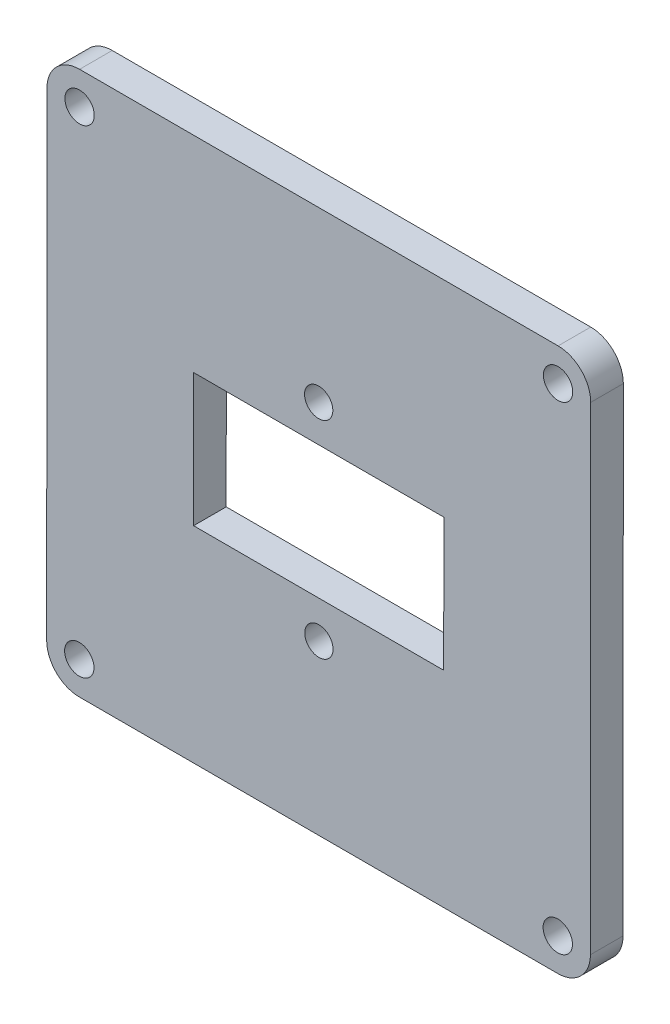
ISO-10303-21;
HEADER;
FILE_DESCRIPTION(('STEP AP214'),'2;1');
FILE_NAME('part.step','',(''),(''),'','','');
FILE_SCHEMA(('AUTOMOTIVE_DESIGN { 1 0 10303 214 1 1 1 1 }'));
ENDSEC;
DATA;
#1=APPLICATION_CONTEXT('core data for automotive mechanical design processes');
#2=APPLICATION_PROTOCOL_DEFINITION('international standard','automotive_design',2000,#1);
#3=PRODUCT_CONTEXT('',#1,'mechanical');
#4=PRODUCT('Part','Part','',(#3));
#5=PRODUCT_RELATED_PRODUCT_CATEGORY('part','',(#4));
#6=PRODUCT_DEFINITION_FORMATION('','',#4);
#7=PRODUCT_DEFINITION_CONTEXT('part definition',#1,'design');
#8=PRODUCT_DEFINITION('design','',#6,#7);
#9=PRODUCT_DEFINITION_SHAPE('','',#8);
#10=(LENGTH_UNIT() NAMED_UNIT(*) SI_UNIT(.MILLI.,.METRE.));
#11=(NAMED_UNIT(*) PLANE_ANGLE_UNIT() SI_UNIT($,.RADIAN.));
#12=(NAMED_UNIT(*) SI_UNIT($,.STERADIAN.) SOLID_ANGLE_UNIT());
#13=UNCERTAINTY_MEASURE_WITH_UNIT(LENGTH_MEASURE(1.E-05),#10,'distance_accuracy_value','');
#14=(GEOMETRIC_REPRESENTATION_CONTEXT(3) GLOBAL_UNCERTAINTY_ASSIGNED_CONTEXT((#13)) GLOBAL_UNIT_ASSIGNED_CONTEXT((#10,
#11,#12)) REPRESENTATION_CONTEXT('',''));
#15=CARTESIAN_POINT('',(0.,0.,0.));
#16=DIRECTION('',(0.,0.,1.));
#17=DIRECTION('',(1.,0.,0.));
#18=AXIS2_PLACEMENT_3D('',#15,#16,#17);
#19=CARTESIAN_POINT('',(294.111009057403,60.8485575874657,-1.28360863604904E-11));
#20=DIRECTION('',(0.,0.,1.));
#21=DIRECTION('',(1.,0.,0.));
#22=AXIS2_PLACEMENT_3D('',#19,#20,#21);
#23=CYLINDRICAL_SURFACE('',#22,3.00000000000005);
#24=CARTESIAN_POINT('',(294.111009057403,60.8485575874657,2.99999999999992));
#25=DIRECTION('',(0.,0.,1.));
#26=DIRECTION('',(1.,0.,0.));
#27=AXIS2_PLACEMENT_3D('',#24,#25,#26);
#28=CIRCLE('',#27,3.00000000000005);
#29=CARTESIAN_POINT('',(294.112797724359,63.8485570542442,2.99999999999992));
#30=VERTEX_POINT('',#29);
#31=CARTESIAN_POINT('',(291.111009590624,60.8503462544219,2.99999999999992));
#32=VERTEX_POINT('',#31);
#33=EDGE_CURVE('E196',#30,#32,#28,.T.);
#34=ORIENTED_EDGE('',*,*,#33,.F.);
#35=DIRECTION('',(0.,0.,1.));
#36=VECTOR('',#35,1.);
#37=CARTESIAN_POINT('',(294.112797724359,63.8485570542442,-1.28360863604904E-11));
#38=LINE('',#37,#36);
#39=CARTESIAN_POINT('',(294.112797724359,63.8485570542442,-1.28360863604904E-11));
#40=VERTEX_POINT('',#39);
#41=EDGE_CURVE('E11',#40,#30,#38,.T.);
#42=ORIENTED_EDGE('',*,*,#41,.F.);
#43=CARTESIAN_POINT('',(294.111009057403,60.8485575874657,-1.28360863604904E-11));
#44=DIRECTION('',(0.,0.,1.));
#45=DIRECTION('',(1.,0.,0.));
#46=AXIS2_PLACEMENT_3D('',#43,#44,#45);
#47=CIRCLE('',#46,3.00000000000005);
#48=CARTESIAN_POINT('',(291.111009590624,60.8503462544219,-1.28360863604904E-11));
#49=VERTEX_POINT('',#48);
#50=EDGE_CURVE('E199',#40,#49,#47,.T.);
#51=ORIENTED_EDGE('',*,*,#50,.T.);
#52=DIRECTION('',(0.,0.,1.));
#53=VECTOR('',#52,1.);
#54=CARTESIAN_POINT('',(291.111009590624,60.8503462544219,-1.28360863604904E-11));
#55=LINE('',#54,#53);
#56=EDGE_CURVE('E40',#49,#32,#55,.T.);
#57=ORIENTED_EDGE('',*,*,#56,.T.);
#58=EDGE_LOOP('',(#34,#42,#51,#57));
#59=FACE_BOUND('',#58,.T.);
#60=ADVANCED_FACE('F37',(#59),#23,.T.);
#61=CARTESIAN_POINT('',(338.112738889808,63.8223233026353,-1.28360863604904E-11));
#62=DIRECTION('',(0.00059622231873901,0.999999822259457,0.));
#63=DIRECTION('',(-0.999999822259457,0.00059622231873901,0.));
#64=AXIS2_PLACEMENT_3D('',#61,#62,#63);
#65=PLANE('',#64);
#66=DIRECTION('',(-0.999999822259458,0.00059622231873901,0.));
#67=VECTOR('',#66,1.);
#68=CARTESIAN_POINT('',(338.112738889808,63.8223233026353,2.99999999999992));
#69=LINE('',#68,#67);
#70=CARTESIAN_POINT('',(338.112738889808,63.8223233026353,2.99999999999992));
#71=VERTEX_POINT('',#70);
#72=EDGE_CURVE('E203',#71,#30,#69,.T.);
#73=ORIENTED_EDGE('',*,*,#72,.F.);
#74=DIRECTION('',(0.,0.,1.));
#75=VECTOR('',#74,1.);
#76=CARTESIAN_POINT('',(338.112738889808,63.8223233026353,-1.28360863604904E-11));
#77=LINE('',#76,#75);
#78=CARTESIAN_POINT('',(338.112738889808,63.8223233026353,-1.28360863604904E-11));
#79=VERTEX_POINT('',#78);
#80=EDGE_CURVE('E45',#79,#71,#77,.T.);
#81=ORIENTED_EDGE('',*,*,#80,.F.);
#82=DIRECTION('',(-0.999999822259458,0.00059622231873901,0.));
#83=VECTOR('',#82,1.);
#84=CARTESIAN_POINT('',(338.112738889808,63.8223233026353,-1.28360863604904E-11));
#85=LINE('',#84,#83);
#86=EDGE_CURVE('E221',#79,#40,#85,.T.);
#87=ORIENTED_EDGE('',*,*,#86,.T.);
#88=ORIENTED_EDGE('',*,*,#41,.T.);
#89=EDGE_LOOP('',(#73,#81,#87,#88));
#90=FACE_BOUND('',#89,.T.);
#91=ADVANCED_FACE('F268',(#90),#65,.T.);
#92=CARTESIAN_POINT('',(338.110950222852,60.8223238358568,-1.28360863604904E-11));
#93=DIRECTION('',(0.,0.,1.));
#94=DIRECTION('',(1.,0.,0.));
#95=AXIS2_PLACEMENT_3D('',#92,#93,#94);
#96=CYLINDRICAL_SURFACE('',#95,3.00000000000005);
#97=CARTESIAN_POINT('',(338.110950222852,60.8223238358568,2.99999999999992));
#98=DIRECTION('',(0.,0.,1.));
#99=DIRECTION('',(1.,0.,0.));
#100=AXIS2_PLACEMENT_3D('',#97,#98,#99);
#101=CIRCLE('',#100,3.00000000000005);
#102=CARTESIAN_POINT('',(341.11094968963,60.8205351689006,2.99999999999992));
#103=VERTEX_POINT('',#102);
#104=EDGE_CURVE('E241',#103,#71,#101,.T.);
#105=ORIENTED_EDGE('',*,*,#104,.F.);
#106=DIRECTION('',(0.,0.,1.));
#107=VECTOR('',#106,1.);
#108=CARTESIAN_POINT('',(341.11094968963,60.8205351689006,-1.28360863604904E-11));
#109=LINE('',#108,#107);
#110=CARTESIAN_POINT('',(341.11094968963,60.8205351689006,-1.28360863604904E-11));
#111=VERTEX_POINT('',#110);
#112=EDGE_CURVE('E247',#111,#103,#109,.T.);
#113=ORIENTED_EDGE('',*,*,#112,.F.);
#114=CARTESIAN_POINT('',(338.110950222852,60.8223238358568,-1.28360863604904E-11));
#115=DIRECTION('',(0.,0.,1.));
#116=DIRECTION('',(1.,0.,0.));
#117=AXIS2_PLACEMENT_3D('',#114,#115,#116);
#118=CIRCLE('',#117,3.00000000000005);
#119=EDGE_CURVE('E218',#111,#79,#118,.T.);
#120=ORIENTED_EDGE('',*,*,#119,.T.);
#121=ORIENTED_EDGE('',*,*,#80,.T.);
#122=EDGE_LOOP('',(#105,#113,#120,#121));
#123=FACE_BOUND('',#122,.T.);
#124=ADVANCED_FACE('F288',(#123),#96,.T.);
#125=CARTESIAN_POINT('',(341.084716118943,16.8208974499682,-1.28360863604904E-11));
#126=DIRECTION('',(0.999999822259457,-0.000596222318738532,0.));
#127=DIRECTION('',(0.000596222318738532,0.999999822259457,0.));
#128=AXIS2_PLACEMENT_3D('',#125,#126,#127);
#129=PLANE('',#128);
#130=DIRECTION('',(0.000596222318738532,0.999999822259458,0.));
#131=VECTOR('',#130,1.);
#132=CARTESIAN_POINT('',(341.084716118943,16.8208974499682,2.99999999999992));
#133=LINE('',#132,#131);
#134=CARTESIAN_POINT('',(341.084716118943,16.8208974499682,2.99999999999992));
#135=VERTEX_POINT('',#134);
#136=EDGE_CURVE('E238',#135,#103,#133,.T.);
#137=ORIENTED_EDGE('',*,*,#136,.F.);
#138=DIRECTION('',(0.,0.,1.));
#139=VECTOR('',#138,1.);
#140=CARTESIAN_POINT('',(341.084716118943,16.8208974499682,-1.28360863604904E-11));
#141=LINE('',#140,#139);
#142=CARTESIAN_POINT('',(341.084716118943,16.8208974499682,-1.28360863604904E-11));
#143=VERTEX_POINT('',#142);
#144=EDGE_CURVE('E249',#143,#135,#141,.T.);
#145=ORIENTED_EDGE('',*,*,#144,.F.);
#146=DIRECTION('',(0.000596222318738532,0.999999822259458,0.));
#147=VECTOR('',#146,1.);
#148=CARTESIAN_POINT('',(341.084716118943,16.8208974499682,-1.28360863604904E-11));
#149=LINE('',#148,#147);
#150=EDGE_CURVE('E215',#143,#111,#149,.T.);
#151=ORIENTED_EDGE('',*,*,#150,.T.);
#152=ORIENTED_EDGE('',*,*,#112,.T.);
#153=EDGE_LOOP('',(#137,#145,#151,#152));
#154=FACE_BOUND('',#153,.T.);
#155=ADVANCED_FACE('F286',(#154),#129,.T.);
#156=CARTESIAN_POINT('',(338.084716652164,16.8226861169244,-1.28360863604904E-11));
#157=DIRECTION('',(0.,0.,1.));
#158=DIRECTION('',(1.,0.,0.));
#159=AXIS2_PLACEMENT_3D('',#156,#157,#158);
#160=CYLINDRICAL_SURFACE('',#159,3.);
#161=CARTESIAN_POINT('',(338.084716652164,16.8226861169244,2.99999999999992));
#162=DIRECTION('',(0.,0.,1.));
#163=DIRECTION('',(1.,0.,0.));
#164=AXIS2_PLACEMENT_3D('',#161,#162,#163);
#165=CIRCLE('',#164,3.);
#166=CARTESIAN_POINT('',(338.082927985208,13.822686650146,2.99999999999992));
#167=VERTEX_POINT('',#166);
#168=EDGE_CURVE('E235',#167,#135,#165,.T.);
#169=ORIENTED_EDGE('',*,*,#168,.F.);
#170=DIRECTION('',(0.,0.,1.));
#171=VECTOR('',#170,1.);
#172=CARTESIAN_POINT('',(338.082927985208,13.822686650146,-1.28360863604904E-11));
#173=LINE('',#172,#171);
#174=CARTESIAN_POINT('',(338.082927985208,13.822686650146,-1.28360863604904E-11));
#175=VERTEX_POINT('',#174);
#176=EDGE_CURVE('E251',#175,#167,#173,.T.);
#177=ORIENTED_EDGE('',*,*,#176,.F.);
#178=CARTESIAN_POINT('',(338.084716652164,16.8226861169244,-1.28360863604904E-11));
#179=DIRECTION('',(0.,0.,1.));
#180=DIRECTION('',(1.,0.,0.));
#181=AXIS2_PLACEMENT_3D('',#178,#179,#180);
#182=CIRCLE('',#181,3.);
#183=EDGE_CURVE('E212',#175,#143,#182,.T.);
#184=ORIENTED_EDGE('',*,*,#183,.T.);
#185=ORIENTED_EDGE('',*,*,#144,.T.);
#186=EDGE_LOOP('',(#169,#177,#184,#185));
#187=FACE_BOUND('',#186,.T.);
#188=ADVANCED_FACE('F282',(#187),#160,.T.);
#189=CARTESIAN_POINT('',(294.082986819759,13.8489204017549,-1.28360863604904E-11));
#190=DIRECTION('',(-0.00059622231873893,-0.999999822259457,0.));
#191=DIRECTION('',(0.999999822259457,-0.00059622231873893,0.));
#192=AXIS2_PLACEMENT_3D('',#189,#190,#191);
#193=PLANE('',#192);
#194=DIRECTION('',(0.999999822259458,-0.00059622231873893,0.));
#195=VECTOR('',#194,1.);
#196=CARTESIAN_POINT('',(294.082986819759,13.8489204017549,2.99999999999992));
#197=LINE('',#196,#195);
#198=CARTESIAN_POINT('',(294.082986819759,13.8489204017549,2.99999999999992));
#199=VERTEX_POINT('',#198);
#200=EDGE_CURVE('E232',#199,#167,#197,.T.);
#201=ORIENTED_EDGE('',*,*,#200,.F.);
#202=DIRECTION('',(0.,0.,1.));
#203=VECTOR('',#202,1.);
#204=CARTESIAN_POINT('',(294.082986819759,13.8489204017549,-1.28360863604904E-11));
#205=LINE('',#204,#203);
#206=CARTESIAN_POINT('',(294.082986819759,13.8489204017549,-1.28360863604904E-11));
#207=VERTEX_POINT('',#206);
#208=EDGE_CURVE('E253',#207,#199,#205,.T.);
#209=ORIENTED_EDGE('',*,*,#208,.F.);
#210=DIRECTION('',(0.999999822259458,-0.00059622231873893,0.));
#211=VECTOR('',#210,1.);
#212=CARTESIAN_POINT('',(294.082986819759,13.8489204017549,-1.28360863604904E-11));
#213=LINE('',#212,#211);
#214=EDGE_CURVE('E209',#207,#175,#213,.T.);
#215=ORIENTED_EDGE('',*,*,#214,.T.);
#216=ORIENTED_EDGE('',*,*,#176,.T.);
#217=EDGE_LOOP('',(#201,#209,#215,#216));
#218=FACE_BOUND('',#217,.T.);
#219=ADVANCED_FACE('F280',(#218),#193,.T.);
#220=CARTESIAN_POINT('',(294.084775486716,16.8489198685333,-1.28360863604904E-11));
#221=DIRECTION('',(0.,0.,1.));
#222=DIRECTION('',(1.,0.,0.));
#223=AXIS2_PLACEMENT_3D('',#220,#221,#222);
#224=CYLINDRICAL_SURFACE('',#223,3.);
#225=CARTESIAN_POINT('',(294.084775486716,16.8489198685333,2.99999999999992));
#226=DIRECTION('',(0.,0.,1.));
#227=DIRECTION('',(1.,0.,0.));
#228=AXIS2_PLACEMENT_3D('',#225,#226,#227);
#229=CIRCLE('',#228,3.);
#230=CARTESIAN_POINT('',(291.084776019937,16.8507085354895,2.99999999999992));
#231=VERTEX_POINT('',#230);
#232=EDGE_CURVE('E229',#231,#199,#229,.T.);
#233=ORIENTED_EDGE('',*,*,#232,.F.);
#234=DIRECTION('',(0.,0.,1.));
#235=VECTOR('',#234,1.);
#236=CARTESIAN_POINT('',(291.084776019937,16.8507085354895,-1.28360863604904E-11));
#237=LINE('',#236,#235);
#238=CARTESIAN_POINT('',(291.084776019937,16.8507085354895,-1.28360863604904E-11));
#239=VERTEX_POINT('',#238);
#240=EDGE_CURVE('E254',#239,#231,#237,.T.);
#241=ORIENTED_EDGE('',*,*,#240,.F.);
#242=CARTESIAN_POINT('',(294.084775486716,16.8489198685333,-1.28360863604904E-11));
#243=DIRECTION('',(0.,0.,1.));
#244=DIRECTION('',(1.,0.,0.));
#245=AXIS2_PLACEMENT_3D('',#242,#243,#244);
#246=CIRCLE('',#245,3.);
#247=EDGE_CURVE('E206',#239,#207,#246,.T.);
#248=ORIENTED_EDGE('',*,*,#247,.T.);
#249=ORIENTED_EDGE('',*,*,#208,.T.);
#250=EDGE_LOOP('',(#233,#241,#248,#249));
#251=FACE_BOUND('',#250,.T.);
#252=ADVANCED_FACE('F276',(#251),#224,.T.);
#253=CARTESIAN_POINT('',(291.111009590624,60.8503462544219,-1.28360863604904E-11));
#254=DIRECTION('',(-0.999999822259457,0.000596222318739793,0.));
#255=DIRECTION('',(-0.000596222318739793,-0.999999822259457,0.));
#256=AXIS2_PLACEMENT_3D('',#253,#254,#255);
#257=PLANE('',#256);
#258=DIRECTION('',(-0.000596222318739793,-0.999999822259458,0.));
#259=VECTOR('',#258,1.);
#260=CARTESIAN_POINT('',(291.111009590624,60.8503462544219,2.99999999999992));
#261=LINE('',#260,#259);
#262=EDGE_CURVE('E226',#32,#231,#261,.T.);
#263=ORIENTED_EDGE('',*,*,#262,.F.);
#264=ORIENTED_EDGE('',*,*,#56,.F.);
#265=DIRECTION('',(-0.000596222318739793,-0.999999822259458,0.));
#266=VECTOR('',#265,1.);
#267=CARTESIAN_POINT('',(291.111009590624,60.8503462544219,-1.28360863604904E-11));
#268=LINE('',#267,#266);
#269=EDGE_CURVE('E202',#49,#239,#268,.T.);
#270=ORIENTED_EDGE('',*,*,#269,.T.);
#271=ORIENTED_EDGE('',*,*,#240,.T.);
#272=EDGE_LOOP('',(#263,#264,#270,#271));
#273=FACE_BOUND('',#272,.T.);
#274=ADVANCED_FACE('F262',(#273),#257,.T.);
#275=CARTESIAN_POINT('',(294.111009057403,60.8485575874657,-1.28360863604904E-11));
#276=DIRECTION('',(0.,0.,1.));
#277=DIRECTION('',(1.,0.,0.));
#278=AXIS2_PLACEMENT_3D('',#275,#276,#277);
#279=PLANE('',#278);
#280=DIRECTION('',(-0.999999822259457,0.000596222318738875,0.));
#281=VECTOR('',#280,1.);
#282=CARTESIAN_POINT('',(304.601683778403,44.9424777835328,-1.28360863604904E-11));
#283=LINE('',#282,#281);
#284=CARTESIAN_POINT('',(327.602382743863,44.9287642510256,-1.28360863604904E-11));
#285=VERTEX_POINT('',#284);
#286=CARTESIAN_POINT('',(304.601683778403,44.9424777835328,-1.28360863604904E-11));
#287=VERTEX_POINT('',#286);
#288=EDGE_CURVE('E134',#285,#287,#283,.T.);
#289=ORIENTED_EDGE('',*,*,#288,.T.);
#290=DIRECTION('',(-0.000596222318741483,-0.999999822259457,0.));
#291=VECTOR('',#290,1.);
#292=CARTESIAN_POINT('',(304.594409615643,32.7420598550267,-1.28360863604904E-11));
#293=LINE('',#292,#291);
#294=CARTESIAN_POINT('',(304.594409615643,32.7420598550267,-1.28360863604904E-11));
#295=VERTEX_POINT('',#294);
#296=EDGE_CURVE('E128',#287,#295,#293,.T.);
#297=ORIENTED_EDGE('',*,*,#296,.T.);
#298=DIRECTION('',(0.999999822259457,-0.000596222318739177,0.));
#299=VECTOR('',#298,1.);
#300=CARTESIAN_POINT('',(327.595108581103,32.7283463225195,-1.28360863604904E-11));
#301=LINE('',#300,#299);
#302=CARTESIAN_POINT('',(327.595108581103,32.7283463225195,-1.28360863604904E-11));
#303=VERTEX_POINT('',#302);
#304=EDGE_CURVE('E137',#295,#303,#301,.T.);
#305=ORIENTED_EDGE('',*,*,#304,.T.);
#306=DIRECTION('',(0.000596222318741483,0.999999822259457,0.));
#307=VECTOR('',#306,1.);
#308=CARTESIAN_POINT('',(327.602382743863,44.9287642510256,-1.28360863604904E-11));
#309=LINE('',#308,#307);
#310=EDGE_CURVE('E53',#303,#285,#309,.T.);
#311=ORIENTED_EDGE('',*,*,#310,.T.);
#312=EDGE_LOOP('',(#289,#297,#305,#311));
#313=FACE_BOUND('',#312,.T.);
#314=CARTESIAN_POINT('',(316.098042718332,48.3168075821039,-1.28360863604904E-11));
#315=DIRECTION('',(0.,0.,1.));
#316=DIRECTION('',(-1.,0.,0.));
#317=AXIS2_PLACEMENT_3D('',#314,#315,#316);
#318=CIRCLE('',#317,1.3);
#319=CARTESIAN_POINT('',(314.798042718332,48.3168075821039,-1.28360863604904E-11));
#320=VERTEX_POINT('',#319);
#321=EDGE_CURVE('E163',#320,#320,#318,.T.);
#322=ORIENTED_EDGE('',*,*,#321,.T.);
#323=EDGE_LOOP('',(#322));
#324=FACE_BOUND('',#323,.T.);
#325=CARTESIAN_POINT('',(316.11876094702,29.3163533968746,-1.28360863604904E-11));
#326=DIRECTION('',(0.,0.,1.));
#327=DIRECTION('',(-1.,0.,0.));
#328=AXIS2_PLACEMENT_3D('',#325,#326,#327);
#329=CIRCLE('',#328,1.3);
#330=CARTESIAN_POINT('',(314.81876094702,29.3163533968746,-1.28360863604904E-11));
#331=VERTEX_POINT('',#330);
#332=EDGE_CURVE('E169',#331,#331,#329,.T.);
#333=ORIENTED_EDGE('',*,*,#332,.T.);
#334=EDGE_LOOP('',(#333));
#335=FACE_BOUND('',#334,.T.);
#336=CARTESIAN_POINT('',(294.084775486716,16.8489198685333,-1.28360863604904E-11));
#337=DIRECTION('',(0.,0.,1.));
#338=DIRECTION('',(-1.,0.,0.));
#339=AXIS2_PLACEMENT_3D('',#336,#337,#338);
#340=CIRCLE('',#339,1.35000000000002);
#341=CARTESIAN_POINT('',(292.734775486716,16.8489198685333,-1.28360863604904E-11));
#342=VERTEX_POINT('',#341);
#343=EDGE_CURVE('E175',#342,#342,#340,.T.);
#344=ORIENTED_EDGE('',*,*,#343,.T.);
#345=EDGE_LOOP('',(#344));
#346=FACE_BOUND('',#345,.T.);
#347=CARTESIAN_POINT('',(338.110950222852,60.8223238358568,-1.28360863604904E-11));
#348=DIRECTION('',(0.,0.,1.));
#349=DIRECTION('',(-1.,0.,0.));
#350=AXIS2_PLACEMENT_3D('',#347,#348,#349);
#351=CIRCLE('',#350,1.35000000000002);
#352=CARTESIAN_POINT('',(336.760950222852,60.8223238358568,-1.28360863604904E-11));
#353=VERTEX_POINT('',#352);
#354=EDGE_CURVE('E181',#353,#353,#351,.T.);
#355=ORIENTED_EDGE('',*,*,#354,.T.);
#356=EDGE_LOOP('',(#355));
#357=FACE_BOUND('',#356,.T.);
#358=CARTESIAN_POINT('',(294.111009057403,60.8485575874657,-1.28360863604904E-11));
#359=DIRECTION('',(0.,0.,1.));
#360=DIRECTION('',(-1.,0.,0.));
#361=AXIS2_PLACEMENT_3D('',#358,#359,#360);
#362=CIRCLE('',#361,1.35000000000002);
#363=CARTESIAN_POINT('',(292.761009057403,60.8485575874657,-1.28360863604904E-11));
#364=VERTEX_POINT('',#363);
#365=EDGE_CURVE('E187',#364,#364,#362,.T.);
#366=ORIENTED_EDGE('',*,*,#365,.T.);
#367=EDGE_LOOP('',(#366));
#368=FACE_BOUND('',#367,.T.);
#369=CARTESIAN_POINT('',(338.084716652164,16.8226861169244,-1.28360863604904E-11));
#370=DIRECTION('',(0.,0.,1.));
#371=DIRECTION('',(-1.,0.,0.));
#372=AXIS2_PLACEMENT_3D('',#369,#370,#371);
#373=CIRCLE('',#372,1.35000000000002);
#374=CARTESIAN_POINT('',(336.734716652164,16.8226861169244,-1.28360863604904E-11));
#375=VERTEX_POINT('',#374);
#376=EDGE_CURVE('E193',#375,#375,#373,.T.);
#377=ORIENTED_EDGE('',*,*,#376,.T.);
#378=EDGE_LOOP('',(#377));
#379=FACE_BOUND('',#378,.T.);
#380=ORIENTED_EDGE('',*,*,#50,.F.);
#381=ORIENTED_EDGE('',*,*,#86,.F.);
#382=ORIENTED_EDGE('',*,*,#119,.F.);
#383=ORIENTED_EDGE('',*,*,#150,.F.);
#384=ORIENTED_EDGE('',*,*,#183,.F.);
#385=ORIENTED_EDGE('',*,*,#214,.F.);
#386=ORIENTED_EDGE('',*,*,#247,.F.);
#387=ORIENTED_EDGE('',*,*,#269,.F.);
#388=EDGE_LOOP('',(#380,#381,#382,#383,#384,#385,#386,#387));
#389=FACE_BOUND('',#388,.T.);
#390=ADVANCED_FACE('F141',(#313,#324,#335,#346,#357,#368,#379,#389),#279,.F.);
#391=CARTESIAN_POINT('',(294.111009057403,60.8485575874657,2.99999999999992));
#392=DIRECTION('',(0.,0.,1.));
#393=DIRECTION('',(1.,0.,0.));
#394=AXIS2_PLACEMENT_3D('',#391,#392,#393);
#395=PLANE('',#394);
#396=DIRECTION('',(-0.000596222318741483,-0.999999822259457,0.));
#397=VECTOR('',#396,1.);
#398=CARTESIAN_POINT('',(304.594409615643,32.7420598550267,2.99999999999992));
#399=LINE('',#398,#397);
#400=CARTESIAN_POINT('',(304.601683778403,44.9424777835328,2.99999999999992));
#401=VERTEX_POINT('',#400);
#402=CARTESIAN_POINT('',(304.594409615643,32.7420598550267,2.99999999999992));
#403=VERTEX_POINT('',#402);
#404=EDGE_CURVE('E61',#401,#403,#399,.T.);
#405=ORIENTED_EDGE('',*,*,#404,.F.);
#406=DIRECTION('',(-0.999999822259457,0.000596222318738875,0.));
#407=VECTOR('',#406,1.);
#408=CARTESIAN_POINT('',(304.601683778403,44.9424777835328,2.99999999999992));
#409=LINE('',#408,#407);
#410=CARTESIAN_POINT('',(327.602382743863,44.9287642510256,2.99999999999992));
#411=VERTEX_POINT('',#410);
#412=EDGE_CURVE('E144',#411,#401,#409,.T.);
#413=ORIENTED_EDGE('',*,*,#412,.F.);
#414=DIRECTION('',(0.000596222318741483,0.999999822259457,0.));
#415=VECTOR('',#414,1.);
#416=CARTESIAN_POINT('',(327.602382743863,44.9287642510256,2.99999999999992));
#417=LINE('',#416,#415);
#418=CARTESIAN_POINT('',(327.595108581103,32.7283463225195,2.99999999999992));
#419=VERTEX_POINT('',#418);
#420=EDGE_CURVE('E147',#419,#411,#417,.T.);
#421=ORIENTED_EDGE('',*,*,#420,.F.);
#422=DIRECTION('',(0.999999822259457,-0.000596222318739177,0.));
#423=VECTOR('',#422,1.);
#424=CARTESIAN_POINT('',(327.595108581103,32.7283463225195,2.99999999999992));
#425=LINE('',#424,#423);
#426=EDGE_CURVE('E153',#403,#419,#425,.T.);
#427=ORIENTED_EDGE('',*,*,#426,.F.);
#428=EDGE_LOOP('',(#405,#413,#421,#427));
#429=FACE_BOUND('',#428,.T.);
#430=CARTESIAN_POINT('',(316.098042718332,48.3168075821039,2.99999999999992));
#431=DIRECTION('',(0.,0.,1.));
#432=DIRECTION('',(-1.,0.,0.));
#433=AXIS2_PLACEMENT_3D('',#430,#431,#432);
#434=CIRCLE('',#433,1.3);
#435=CARTESIAN_POINT('',(314.798042718332,48.3168075821039,2.99999999999992));
#436=VERTEX_POINT('',#435);
#437=EDGE_CURVE('E159',#436,#436,#434,.T.);
#438=ORIENTED_EDGE('',*,*,#437,.F.);
#439=EDGE_LOOP('',(#438));
#440=FACE_BOUND('',#439,.T.);
#441=CARTESIAN_POINT('',(316.11876094702,29.3163533968746,2.99999999999992));
#442=DIRECTION('',(0.,0.,1.));
#443=DIRECTION('',(-1.,0.,0.));
#444=AXIS2_PLACEMENT_3D('',#441,#442,#443);
#445=CIRCLE('',#444,1.3);
#446=CARTESIAN_POINT('',(314.81876094702,29.3163533968746,2.99999999999992));
#447=VERTEX_POINT('',#446);
#448=EDGE_CURVE('E166',#447,#447,#445,.T.);
#449=ORIENTED_EDGE('',*,*,#448,.F.);
#450=EDGE_LOOP('',(#449));
#451=FACE_BOUND('',#450,.T.);
#452=CARTESIAN_POINT('',(294.084775486716,16.8489198685333,2.99999999999992));
#453=DIRECTION('',(0.,0.,1.));
#454=DIRECTION('',(-1.,0.,0.));
#455=AXIS2_PLACEMENT_3D('',#452,#453,#454);
#456=CIRCLE('',#455,1.35000000000002);
#457=CARTESIAN_POINT('',(292.734775486716,16.8489198685333,2.99999999999992));
#458=VERTEX_POINT('',#457);
#459=EDGE_CURVE('E172',#458,#458,#456,.T.);
#460=ORIENTED_EDGE('',*,*,#459,.F.);
#461=EDGE_LOOP('',(#460));
#462=FACE_BOUND('',#461,.T.);
#463=CARTESIAN_POINT('',(338.110950222852,60.8223238358568,2.99999999999992));
#464=DIRECTION('',(0.,0.,1.));
#465=DIRECTION('',(-1.,0.,0.));
#466=AXIS2_PLACEMENT_3D('',#463,#464,#465);
#467=CIRCLE('',#466,1.35000000000002);
#468=CARTESIAN_POINT('',(336.760950222852,60.8223238358568,2.99999999999992));
#469=VERTEX_POINT('',#468);
#470=EDGE_CURVE('E178',#469,#469,#467,.T.);
#471=ORIENTED_EDGE('',*,*,#470,.F.);
#472=EDGE_LOOP('',(#471));
#473=FACE_BOUND('',#472,.T.);
#474=CARTESIAN_POINT('',(294.111009057403,60.8485575874657,2.99999999999992));
#475=DIRECTION('',(0.,0.,1.));
#476=DIRECTION('',(-1.,0.,0.));
#477=AXIS2_PLACEMENT_3D('',#474,#475,#476);
#478=CIRCLE('',#477,1.35000000000002);
#479=CARTESIAN_POINT('',(292.761009057403,60.8485575874657,2.99999999999992));
#480=VERTEX_POINT('',#479);
#481=EDGE_CURVE('E184',#480,#480,#478,.T.);
#482=ORIENTED_EDGE('',*,*,#481,.F.);
#483=EDGE_LOOP('',(#482));
#484=FACE_BOUND('',#483,.T.);
#485=CARTESIAN_POINT('',(338.084716652164,16.8226861169244,2.99999999999992));
#486=DIRECTION('',(0.,0.,1.));
#487=DIRECTION('',(-1.,0.,0.));
#488=AXIS2_PLACEMENT_3D('',#485,#486,#487);
#489=CIRCLE('',#488,1.35000000000002);
#490=CARTESIAN_POINT('',(336.734716652164,16.8226861169244,2.99999999999992));
#491=VERTEX_POINT('',#490);
#492=EDGE_CURVE('E190',#491,#491,#489,.T.);
#493=ORIENTED_EDGE('',*,*,#492,.F.);
#494=EDGE_LOOP('',(#493));
#495=FACE_BOUND('',#494,.T.);
#496=ORIENTED_EDGE('',*,*,#33,.T.);
#497=ORIENTED_EDGE('',*,*,#262,.T.);
#498=ORIENTED_EDGE('',*,*,#232,.T.);
#499=ORIENTED_EDGE('',*,*,#200,.T.);
#500=ORIENTED_EDGE('',*,*,#168,.T.);
#501=ORIENTED_EDGE('',*,*,#136,.T.);
#502=ORIENTED_EDGE('',*,*,#104,.T.);
#503=ORIENTED_EDGE('',*,*,#72,.T.);
#504=EDGE_LOOP('',(#496,#497,#498,#499,#500,#501,#502,#503));
#505=FACE_BOUND('',#504,.T.);
#506=ADVANCED_FACE('F264',(#429,#440,#451,#462,#473,#484,#495,#505),#395,.T.);
#507=CARTESIAN_POINT('',(338.084716652164,16.8226861169244,-1.28360863604904E-11));
#508=DIRECTION('',(0.,0.,1.));
#509=DIRECTION('',(1.,0.,0.));
#510=AXIS2_PLACEMENT_3D('',#507,#508,#509);
#511=CYLINDRICAL_SURFACE('',#510,1.35000000000002);
#512=ORIENTED_EDGE('',*,*,#376,.F.);
#513=EDGE_LOOP('',(#512));
#514=FACE_BOUND('',#513,.T.);
#515=ORIENTED_EDGE('',*,*,#492,.T.);
#516=EDGE_LOOP('',(#515));
#517=FACE_BOUND('',#516,.T.);
#518=ADVANCED_FACE('F362',(#514,#517),#511,.F.);
#519=CARTESIAN_POINT('',(294.111009057403,60.8485575874657,-1.28360863604904E-11));
#520=DIRECTION('',(0.,0.,1.));
#521=DIRECTION('',(1.,0.,0.));
#522=AXIS2_PLACEMENT_3D('',#519,#520,#521);
#523=CYLINDRICAL_SURFACE('',#522,1.35000000000002);
#524=ORIENTED_EDGE('',*,*,#365,.F.);
#525=EDGE_LOOP('',(#524));
#526=FACE_BOUND('',#525,.T.);
#527=ORIENTED_EDGE('',*,*,#481,.T.);
#528=EDGE_LOOP('',(#527));
#529=FACE_BOUND('',#528,.T.);
#530=ADVANCED_FACE('F372',(#526,#529),#523,.F.);
#531=CARTESIAN_POINT('',(338.110950222852,60.8223238358568,-1.28360863604904E-11));
#532=DIRECTION('',(0.,0.,1.));
#533=DIRECTION('',(1.,0.,0.));
#534=AXIS2_PLACEMENT_3D('',#531,#532,#533);
#535=CYLINDRICAL_SURFACE('',#534,1.35000000000002);
#536=ORIENTED_EDGE('',*,*,#354,.F.);
#537=EDGE_LOOP('',(#536));
#538=FACE_BOUND('',#537,.T.);
#539=ORIENTED_EDGE('',*,*,#470,.T.);
#540=EDGE_LOOP('',(#539));
#541=FACE_BOUND('',#540,.T.);
#542=ADVANCED_FACE('F382',(#538,#541),#535,.F.);
#543=CARTESIAN_POINT('',(294.084775486716,16.8489198685333,-1.28360863604904E-11));
#544=DIRECTION('',(0.,0.,1.));
#545=DIRECTION('',(1.,0.,0.));
#546=AXIS2_PLACEMENT_3D('',#543,#544,#545);
#547=CYLINDRICAL_SURFACE('',#546,1.35000000000002);
#548=ORIENTED_EDGE('',*,*,#343,.F.);
#549=EDGE_LOOP('',(#548));
#550=FACE_BOUND('',#549,.T.);
#551=ORIENTED_EDGE('',*,*,#459,.T.);
#552=EDGE_LOOP('',(#551));
#553=FACE_BOUND('',#552,.T.);
#554=ADVANCED_FACE('F392',(#550,#553),#547,.F.);
#555=CARTESIAN_POINT('',(316.11876094702,29.3163533968746,-1.28360863604904E-11));
#556=DIRECTION('',(0.,0.,1.));
#557=DIRECTION('',(1.,0.,0.));
#558=AXIS2_PLACEMENT_3D('',#555,#556,#557);
#559=CYLINDRICAL_SURFACE('',#558,1.3);
#560=ORIENTED_EDGE('',*,*,#332,.F.);
#561=EDGE_LOOP('',(#560));
#562=FACE_BOUND('',#561,.T.);
#563=ORIENTED_EDGE('',*,*,#448,.T.);
#564=EDGE_LOOP('',(#563));
#565=FACE_BOUND('',#564,.T.);
#566=ADVANCED_FACE('F402',(#562,#565),#559,.F.);
#567=CARTESIAN_POINT('',(316.098042718332,48.3168075821039,-1.28360863604904E-11));
#568=DIRECTION('',(0.,0.,1.));
#569=DIRECTION('',(1.,0.,0.));
#570=AXIS2_PLACEMENT_3D('',#567,#568,#569);
#571=CYLINDRICAL_SURFACE('',#570,1.3);
#572=ORIENTED_EDGE('',*,*,#321,.F.);
#573=EDGE_LOOP('',(#572));
#574=FACE_BOUND('',#573,.T.);
#575=ORIENTED_EDGE('',*,*,#437,.T.);
#576=EDGE_LOOP('',(#575));
#577=FACE_BOUND('',#576,.T.);
#578=ADVANCED_FACE('F412',(#574,#577),#571,.F.);
#579=CARTESIAN_POINT('',(304.594409615643,32.7420598550267,-1.28360863604904E-11));
#580=DIRECTION('',(-0.999999822259457,0.000596222318741483,0.));
#581=DIRECTION('',(-0.000596222318741483,-0.999999822259457,0.));
#582=AXIS2_PLACEMENT_3D('',#579,#580,#581);
#583=PLANE('',#582);
#584=ORIENTED_EDGE('',*,*,#404,.T.);
#585=DIRECTION('',(0.,0.,1.));
#586=VECTOR('',#585,1.);
#587=CARTESIAN_POINT('',(304.594409615643,32.7420598550267,-1.28360863604904E-11));
#588=LINE('',#587,#586);
#589=EDGE_CURVE('E124',#295,#403,#588,.T.);
#590=ORIENTED_EDGE('',*,*,#589,.F.);
#591=ORIENTED_EDGE('',*,*,#296,.F.);
#592=DIRECTION('',(0.,0.,1.));
#593=VECTOR('',#592,1.);
#594=CARTESIAN_POINT('',(304.601683778403,44.9424777835328,-1.28360863604904E-11));
#595=LINE('',#594,#593);
#596=EDGE_CURVE('E157',#287,#401,#595,.T.);
#597=ORIENTED_EDGE('',*,*,#596,.T.);
#598=EDGE_LOOP('',(#584,#590,#591,#597));
#599=FACE_BOUND('',#598,.T.);
#600=ADVANCED_FACE('F126',(#599),#583,.F.);
#601=CARTESIAN_POINT('',(304.601683778403,44.9424777835328,-1.28360863604904E-11));
#602=DIRECTION('',(0.000596222318738875,0.999999822259457,0.));
#603=DIRECTION('',(-0.999999822259457,0.000596222318738875,0.));
#604=AXIS2_PLACEMENT_3D('',#601,#602,#603);
#605=PLANE('',#604);
#606=ORIENTED_EDGE('',*,*,#412,.T.);
#607=ORIENTED_EDGE('',*,*,#596,.F.);
#608=ORIENTED_EDGE('',*,*,#288,.F.);
#609=DIRECTION('',(0.,0.,1.));
#610=VECTOR('',#609,1.);
#611=CARTESIAN_POINT('',(327.602382743863,44.9287642510256,-1.28360863604904E-11));
#612=LINE('',#611,#610);
#613=EDGE_CURVE('E160',#285,#411,#612,.T.);
#614=ORIENTED_EDGE('',*,*,#613,.T.);
#615=EDGE_LOOP('',(#606,#607,#608,#614));
#616=FACE_BOUND('',#615,.T.);
#617=ADVANCED_FACE('F431',(#616),#605,.F.);
#618=CARTESIAN_POINT('',(327.602382743863,44.9287642510256,-1.28360863604904E-11));
#619=DIRECTION('',(0.999999822259458,-0.000596222318741483,0.));
#620=DIRECTION('',(0.000596222318741483,0.999999822259458,0.));
#621=AXIS2_PLACEMENT_3D('',#618,#619,#620);
#622=PLANE('',#621);
#623=ORIENTED_EDGE('',*,*,#420,.T.);
#624=ORIENTED_EDGE('',*,*,#613,.F.);
#625=ORIENTED_EDGE('',*,*,#310,.F.);
#626=DIRECTION('',(0.,0.,1.));
#627=VECTOR('',#626,1.);
#628=CARTESIAN_POINT('',(327.595108581103,32.7283463225195,-1.28360863604904E-11));
#629=LINE('',#628,#627);
#630=EDGE_CURVE('E133',#303,#419,#629,.T.);
#631=ORIENTED_EDGE('',*,*,#630,.T.);
#632=EDGE_LOOP('',(#623,#624,#625,#631));
#633=FACE_BOUND('',#632,.T.);
#634=ADVANCED_FACE('F440',(#633),#622,.F.);
#635=CARTESIAN_POINT('',(327.595108581103,32.7283463225195,-1.28360863604904E-11));
#636=DIRECTION('',(-0.000596222318739177,-0.999999822259457,0.));
#637=DIRECTION('',(0.999999822259457,-0.000596222318739177,0.));
#638=AXIS2_PLACEMENT_3D('',#635,#636,#637);
#639=PLANE('',#638);
#640=ORIENTED_EDGE('',*,*,#426,.T.);
#641=ORIENTED_EDGE('',*,*,#630,.F.);
#642=ORIENTED_EDGE('',*,*,#304,.F.);
#643=ORIENTED_EDGE('',*,*,#589,.T.);
#644=EDGE_LOOP('',(#640,#641,#642,#643));
#645=FACE_BOUND('',#644,.T.);
#646=ADVANCED_FACE('F138',(#645),#639,.F.);
#647=CLOSED_SHELL('',(#60,#91,#124,#155,#188,#219,#252,#274,#390,#506,#518,#530,#542,#554,#566,
#578,#600,#617,#634,#646));
#648=MANIFOLD_SOLID_BREP('B2',#647);
#649=ADVANCED_BREP_SHAPE_REPRESENTATION('',(#18,#648),#14);
#650=SHAPE_DEFINITION_REPRESENTATION(#9,#649);
ENDSEC;
END-ISO-10303-21;
